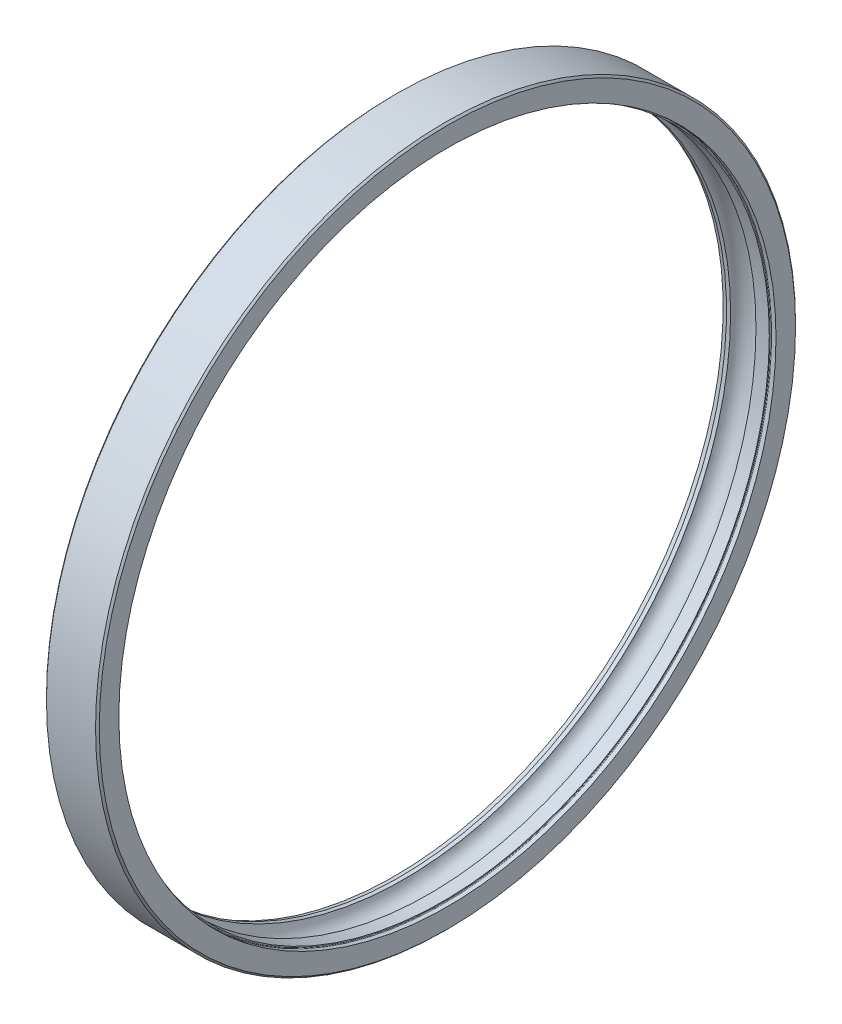
ISO-10303-21;
HEADER;
FILE_DESCRIPTION(('STEP AP214'),'2;1');
FILE_NAME('part.step','',(''),(''),'','','');
FILE_SCHEMA(('AUTOMOTIVE_DESIGN { 1 0 10303 214 1 1 1 1 }'));
ENDSEC;
DATA;
#1=APPLICATION_CONTEXT('core data for automotive mechanical design processes');
#2=APPLICATION_PROTOCOL_DEFINITION('international standard','automotive_design',2000,#1);
#3=PRODUCT_CONTEXT('',#1,'mechanical');
#4=PRODUCT('Part','Part','',(#3));
#5=PRODUCT_RELATED_PRODUCT_CATEGORY('part','',(#4));
#6=PRODUCT_DEFINITION_FORMATION('','',#4);
#7=PRODUCT_DEFINITION_CONTEXT('part definition',#1,'design');
#8=PRODUCT_DEFINITION('design','',#6,#7);
#9=PRODUCT_DEFINITION_SHAPE('','',#8);
#10=(LENGTH_UNIT() NAMED_UNIT(*) SI_UNIT(.MILLI.,.METRE.));
#11=(NAMED_UNIT(*) PLANE_ANGLE_UNIT() SI_UNIT($,.RADIAN.));
#12=(NAMED_UNIT(*) SI_UNIT($,.STERADIAN.) SOLID_ANGLE_UNIT());
#13=UNCERTAINTY_MEASURE_WITH_UNIT(LENGTH_MEASURE(1.E-05),#10,'distance_accuracy_value','');
#14=(GEOMETRIC_REPRESENTATION_CONTEXT(3) GLOBAL_UNCERTAINTY_ASSIGNED_CONTEXT((#13)) GLOBAL_UNIT_ASSIGNED_CONTEXT((#10,
#11,#12)) REPRESENTATION_CONTEXT('',''));
#15=CARTESIAN_POINT('',(0.,0.,0.));
#16=DIRECTION('',(0.,0.,1.));
#17=DIRECTION('',(1.,0.,0.));
#18=AXIS2_PLACEMENT_3D('',#15,#16,#17);
#19=CARTESIAN_POINT('',(-4.,-53.3012864825976,-52.717157287525));
#20=DIRECTION('',(-1.,0.,0.));
#21=DIRECTION('',(0.,0.,1.));
#22=AXIS2_PLACEMENT_3D('',#19,#20,#21);
#23=PLANE('',#22);
#24=CARTESIAN_POINT('',(-4.,0.,0.));
#25=DIRECTION('',(-1.,0.,0.));
#26=DIRECTION('',(0.,0.,-1.));
#27=AXIS2_PLACEMENT_3D('',#24,#25,#26);
#28=CIRCLE('',#27,52.717157287525);
#29=CARTESIAN_POINT('',(-4.,0.,-52.717157287525));
#30=VERTEX_POINT('',#29);
#31=EDGE_CURVE('E62',#30,#30,#28,.F.);
#32=ORIENTED_EDGE('',*,*,#31,.F.);
#33=EDGE_LOOP('',(#32));
#34=FACE_BOUND('',#33,.T.);
#35=CARTESIAN_POINT('',(-4.,0.,0.));
#36=DIRECTION('',(1.,0.,0.));
#37=DIRECTION('',(0.,0.,1.));
#38=AXIS2_PLACEMENT_3D('',#35,#36,#37);
#39=CIRCLE('',#38,49.755);
#40=CARTESIAN_POINT('',(-4.,0.,49.755));
#41=VERTEX_POINT('',#40);
#42=EDGE_CURVE('E59',#41,#41,#39,.T.);
#43=ORIENTED_EDGE('',*,*,#42,.T.);
#44=EDGE_LOOP('',(#43));
#45=FACE_BOUND('',#44,.T.);
#46=ADVANCED_FACE('F15',(#34,#45),#23,.T.);
#47=CARTESIAN_POINT('',(4.,-53.3012864944016,52.717157287525));
#48=DIRECTION('',(1.,0.,0.));
#49=DIRECTION('',(0.,0.,-1.));
#50=AXIS2_PLACEMENT_3D('',#47,#48,#49);
#51=PLANE('',#50);
#52=CARTESIAN_POINT('',(4.,0.,0.));
#53=DIRECTION('',(1.,0.,0.));
#54=DIRECTION('',(0.,-1.16840780209601E-09,1.));
#55=AXIS2_PLACEMENT_3D('',#52,#53,#54);
#56=CIRCLE('',#55,52.717157287525);
#57=CARTESIAN_POINT('',(4.,-6.15951378790669E-08,52.717157287525));
#58=VERTEX_POINT('',#57);
#59=EDGE_CURVE('E56',#58,#58,#56,.T.);
#60=ORIENTED_EDGE('',*,*,#59,.T.);
#61=EDGE_LOOP('',(#60));
#62=FACE_BOUND('',#61,.T.);
#63=CARTESIAN_POINT('',(4.,0.,0.));
#64=DIRECTION('',(-1.,0.,0.));
#65=DIRECTION('',(0.,0.,-1.));
#66=AXIS2_PLACEMENT_3D('',#63,#64,#65);
#67=CIRCLE('',#66,49.755);
#68=CARTESIAN_POINT('',(4.,0.,-49.755));
#69=VERTEX_POINT('',#68);
#70=EDGE_CURVE('E53',#69,#69,#67,.F.);
#71=ORIENTED_EDGE('',*,*,#70,.F.);
#72=EDGE_LOOP('',(#71));
#73=FACE_BOUND('',#72,.T.);
#74=ADVANCED_FACE('F71',(#62,#73),#51,.T.);
#75=CARTESIAN_POINT('',(3.24,-50.205199242003,-49.655));
#76=DIRECTION('',(1.,0.,0.));
#77=DIRECTION('',(0.,1.,0.));
#78=AXIS2_PLACEMENT_3D('',#75,#76,#77);
#79=PLANE('',#78);
#80=CARTESIAN_POINT('',(3.24,0.,0.));
#81=DIRECTION('',(1.,0.,0.));
#82=DIRECTION('',(0.,0.,1.));
#83=AXIS2_PLACEMENT_3D('',#80,#81,#82);
#84=CIRCLE('',#83,49.655);
#85=CARTESIAN_POINT('',(3.24,0.,49.655));
#86=VERTEX_POINT('',#85);
#87=EDGE_CURVE('E50',#86,#86,#84,.T.);
#88=ORIENTED_EDGE('',*,*,#87,.T.);
#89=EDGE_LOOP('',(#88));
#90=FACE_BOUND('',#89,.T.);
#91=CARTESIAN_POINT('',(3.24,0.,0.));
#92=DIRECTION('',(-1.,0.,0.));
#93=DIRECTION('',(0.,0.,-1.));
#94=AXIS2_PLACEMENT_3D('',#91,#92,#93);
#95=CIRCLE('',#94,49.5);
#96=CARTESIAN_POINT('',(3.24,0.,-49.5));
#97=VERTEX_POINT('',#96);
#98=EDGE_CURVE('E47',#97,#97,#95,.F.);
#99=ORIENTED_EDGE('',*,*,#98,.F.);
#100=EDGE_LOOP('',(#99));
#101=FACE_BOUND('',#100,.T.);
#102=ADVANCED_FACE('F115',(#90,#101),#79,.T.);
#103=CARTESIAN_POINT('',(-3.24,-50.205199242003,49.655));
#104=DIRECTION('',(-1.,0.,0.));
#105=DIRECTION('',(0.,1.,0.));
#106=AXIS2_PLACEMENT_3D('',#103,#104,#105);
#107=PLANE('',#106);
#108=CARTESIAN_POINT('',(-3.24,0.,0.));
#109=DIRECTION('',(-1.,0.,0.));
#110=DIRECTION('',(0.,0.,-1.));
#111=AXIS2_PLACEMENT_3D('',#108,#109,#110);
#112=CIRCLE('',#111,49.655);
#113=CARTESIAN_POINT('',(-3.24,0.,-49.655));
#114=VERTEX_POINT('',#113);
#115=EDGE_CURVE('E44',#114,#114,#112,.F.);
#116=ORIENTED_EDGE('',*,*,#115,.F.);
#117=EDGE_LOOP('',(#116));
#118=FACE_BOUND('',#117,.T.);
#119=CARTESIAN_POINT('',(-3.24,0.,0.));
#120=DIRECTION('',(1.,0.,0.));
#121=DIRECTION('',(0.,0.,1.));
#122=AXIS2_PLACEMENT_3D('',#119,#120,#121);
#123=CIRCLE('',#122,49.5);
#124=CARTESIAN_POINT('',(-3.24,0.,49.5));
#125=VERTEX_POINT('',#124);
#126=EDGE_CURVE('E41',#125,#125,#123,.T.);
#127=ORIENTED_EDGE('',*,*,#126,.T.);
#128=EDGE_LOOP('',(#127));
#129=FACE_BOUND('',#128,.T.);
#130=ADVANCED_FACE('F111',(#118,#129),#107,.T.);
#131=CARTESIAN_POINT('',(3.71715728752539,0.,0.));
#132=DIRECTION('',(-1.,0.,0.));
#133=DIRECTION('',(0.,0.,-1.));
#134=AXIS2_PLACEMENT_3D('',#131,#132,#133);
#135=CONICAL_SURFACE('',#134,53.,0.785398163398146);
#136=ORIENTED_EDGE('',*,*,#59,.F.);
#137=EDGE_LOOP('',(#136));
#138=FACE_BOUND('',#137,.T.);
#139=CARTESIAN_POINT('',(3.71715728752539,0.,0.));
#140=DIRECTION('',(1.,0.,0.));
#141=DIRECTION('',(0.,0.,1.));
#142=AXIS2_PLACEMENT_3D('',#139,#140,#141);
#143=CIRCLE('',#142,53.);
#144=CARTESIAN_POINT('',(3.71715728752539,0.,53.));
#145=VERTEX_POINT('',#144);
#146=EDGE_CURVE('E38',#145,#145,#143,.T.);
#147=ORIENTED_EDGE('',*,*,#146,.T.);
#148=EDGE_LOOP('',(#147));
#149=FACE_BOUND('',#148,.T.);
#150=ADVANCED_FACE('F107',(#138,#149),#135,.T.);
#151=CARTESIAN_POINT('',(10.,0.,0.));
#152=DIRECTION('',(1.,0.,0.));
#153=DIRECTION('',(0.,0.,1.));
#154=AXIS2_PLACEMENT_3D('',#151,#152,#153);
#155=CYLINDRICAL_SURFACE('',#154,53.);
#156=CARTESIAN_POINT('',(-3.7171572875254,0.,0.));
#157=DIRECTION('',(1.,0.,0.));
#158=DIRECTION('',(0.,0.,1.));
#159=AXIS2_PLACEMENT_3D('',#156,#157,#158);
#160=CIRCLE('',#159,53.);
#161=CARTESIAN_POINT('',(-3.7171572875254,0.,53.));
#162=VERTEX_POINT('',#161);
#163=EDGE_CURVE('E35',#162,#162,#160,.T.);
#164=ORIENTED_EDGE('',*,*,#163,.T.);
#165=EDGE_LOOP('',(#164));
#166=FACE_BOUND('',#165,.T.);
#167=ORIENTED_EDGE('',*,*,#146,.F.);
#168=EDGE_LOOP('',(#167));
#169=FACE_BOUND('',#168,.T.);
#170=ADVANCED_FACE('F104',(#166,#169),#155,.T.);
#171=CARTESIAN_POINT('',(-3.7171572875254,0.,0.));
#172=DIRECTION('',(1.,0.,0.));
#173=DIRECTION('',(0.,0.,1.));
#174=AXIS2_PLACEMENT_3D('',#171,#172,#173);
#175=CONICAL_SURFACE('',#174,53.,0.785398163398154);
#176=ORIENTED_EDGE('',*,*,#31,.T.);
#177=EDGE_LOOP('',(#176));
#178=FACE_BOUND('',#177,.T.);
#179=ORIENTED_EDGE('',*,*,#163,.F.);
#180=EDGE_LOOP('',(#179));
#181=FACE_BOUND('',#180,.T.);
#182=ADVANCED_FACE('F66',(#178,#181),#175,.T.);
#183=CARTESIAN_POINT('',(3.33999999999932,0.,0.));
#184=DIRECTION('',(1.,0.,0.));
#185=DIRECTION('',(0.,0.,1.));
#186=AXIS2_PLACEMENT_3D('',#183,#184,#185);
#187=TOROIDAL_SURFACE('',#186,49.6550000000007,0.0999999999993229);
#188=ORIENTED_EDGE('',*,*,#87,.F.);
#189=EDGE_LOOP('',(#188));
#190=FACE_BOUND('',#189,.T.);
#191=CARTESIAN_POINT('',(3.33999999999932,0.,0.));
#192=DIRECTION('',(1.,0.,0.));
#193=DIRECTION('',(0.,0.,1.));
#194=AXIS2_PLACEMENT_3D('',#191,#192,#193);
#195=CIRCLE('',#194,49.755);
#196=CARTESIAN_POINT('',(3.33999999999932,0.,49.755));
#197=VERTEX_POINT('',#196);
#198=EDGE_CURVE('E30',#197,#197,#195,.T.);
#199=ORIENTED_EDGE('',*,*,#198,.T.);
#200=EDGE_LOOP('',(#199));
#201=FACE_BOUND('',#200,.T.);
#202=ADVANCED_FACE('F97',(#190,#201),#187,.F.);
#203=CARTESIAN_POINT('',(4.,0.,0.));
#204=DIRECTION('',(1.,0.,0.));
#205=DIRECTION('',(0.,1.16834776332106E-09,1.));
#206=AXIS2_PLACEMENT_3D('',#203,#204,#205);
#207=CYLINDRICAL_SURFACE('',#206,49.755);
#208=ORIENTED_EDGE('',*,*,#70,.T.);
#209=EDGE_LOOP('',(#208));
#210=FACE_BOUND('',#209,.T.);
#211=ORIENTED_EDGE('',*,*,#198,.F.);
#212=EDGE_LOOP('',(#211));
#213=FACE_BOUND('',#212,.T.);
#214=ADVANCED_FACE('F93',(#210,#213),#207,.F.);
#215=CARTESIAN_POINT('',(10.,0.,0.));
#216=DIRECTION('',(1.,0.,0.));
#217=DIRECTION('',(0.,1.92344929213359E-10,1.));
#218=AXIS2_PLACEMENT_3D('',#215,#216,#217);
#219=CYLINDRICAL_SURFACE('',#218,49.5);
#220=ORIENTED_EDGE('',*,*,#98,.T.);
#221=EDGE_LOOP('',(#220));
#222=FACE_BOUND('',#221,.T.);
#223=CARTESIAN_POINT('',(1.22147917197766,0.,0.));
#224=DIRECTION('',(-1.,0.,0.));
#225=DIRECTION('',(0.,0.,-1.));
#226=AXIS2_PLACEMENT_3D('',#223,#224,#225);
#227=CIRCLE('',#226,49.5);
#228=CARTESIAN_POINT('',(1.22147917197766,0.,-49.5));
#229=VERTEX_POINT('',#228);
#230=EDGE_CURVE('E26',#229,#229,#227,.F.);
#231=ORIENTED_EDGE('',*,*,#230,.F.);
#232=EDGE_LOOP('',(#231));
#233=FACE_BOUND('',#232,.T.);
#234=ADVANCED_FACE('F90',(#222,#233),#219,.F.);
#235=CARTESIAN_POINT('',(-0.699,0.,0.));
#236=DIRECTION('',(1.,0.,0.));
#237=DIRECTION('',(0.,0.,1.));
#238=AXIS2_PLACEMENT_3D('',#235,#236,#237);
#239=TOROIDAL_SURFACE('',#238,49.,1.9845);
#240=CARTESIAN_POINT('',(-2.61947917197766,0.,0.));
#241=DIRECTION('',(-1.,0.,0.));
#242=DIRECTION('',(0.,0.,-1.));
#243=AXIS2_PLACEMENT_3D('',#240,#241,#242);
#244=CIRCLE('',#243,49.5);
#245=CARTESIAN_POINT('',(-2.61947917197766,0.,-49.5));
#246=VERTEX_POINT('',#245);
#247=EDGE_CURVE('E22',#246,#246,#244,.T.);
#248=ORIENTED_EDGE('',*,*,#247,.T.);
#249=EDGE_LOOP('',(#248));
#250=FACE_BOUND('',#249,.T.);
#251=ORIENTED_EDGE('',*,*,#230,.T.);
#252=EDGE_LOOP('',(#251));
#253=FACE_BOUND('',#252,.T.);
#254=ADVANCED_FACE('F84',(#250,#253),#239,.F.);
#255=CARTESIAN_POINT('',(10.,0.,0.));
#256=DIRECTION('',(1.,0.,0.));
#257=DIRECTION('',(0.,0.,1.));
#258=AXIS2_PLACEMENT_3D('',#255,#256,#257);
#259=CYLINDRICAL_SURFACE('',#258,49.5);
#260=ORIENTED_EDGE('',*,*,#247,.F.);
#261=EDGE_LOOP('',(#260));
#262=FACE_BOUND('',#261,.T.);
#263=ORIENTED_EDGE('',*,*,#126,.F.);
#264=EDGE_LOOP('',(#263));
#265=FACE_BOUND('',#264,.T.);
#266=ADVANCED_FACE('F77',(#262,#265),#259,.F.);
#267=CARTESIAN_POINT('',(4.,0.,0.));
#268=DIRECTION('',(1.,0.,0.));
#269=DIRECTION('',(0.,0.,1.));
#270=AXIS2_PLACEMENT_3D('',#267,#268,#269);
#271=CYLINDRICAL_SURFACE('',#270,49.755);
#272=ORIENTED_EDGE('',*,*,#42,.F.);
#273=EDGE_LOOP('',(#272));
#274=FACE_BOUND('',#273,.T.);
#275=CARTESIAN_POINT('',(-3.34,0.,0.));
#276=DIRECTION('',(1.,0.,0.));
#277=DIRECTION('',(0.,0.,1.));
#278=AXIS2_PLACEMENT_3D('',#275,#276,#277);
#279=CIRCLE('',#278,49.755);
#280=CARTESIAN_POINT('',(-3.34,0.,49.755));
#281=VERTEX_POINT('',#280);
#282=EDGE_CURVE('E10',#281,#281,#279,.T.);
#283=ORIENTED_EDGE('',*,*,#282,.T.);
#284=EDGE_LOOP('',(#283));
#285=FACE_BOUND('',#284,.T.);
#286=ADVANCED_FACE('F75',(#274,#285),#271,.F.);
#287=CARTESIAN_POINT('',(-3.33999999999932,0.,0.));
#288=DIRECTION('',(1.,0.,0.));
#289=DIRECTION('',(0.,0.,1.));
#290=AXIS2_PLACEMENT_3D('',#287,#288,#289);
#291=TOROIDAL_SURFACE('',#290,49.6550000000007,0.0999999999993242);
#292=ORIENTED_EDGE('',*,*,#115,.T.);
#293=EDGE_LOOP('',(#292));
#294=FACE_BOUND('',#293,.T.);
#295=ORIENTED_EDGE('',*,*,#282,.F.);
#296=EDGE_LOOP('',(#295));
#297=FACE_BOUND('',#296,.T.);
#298=ADVANCED_FACE('F17',(#294,#297),#291,.F.);
#299=CLOSED_SHELL('',(#46,#74,#102,#130,#150,#170,#182,#202,#214,#234,#254,#266,#286,#298));
#300=MANIFOLD_SOLID_BREP('B1',#299);
#301=ADVANCED_BREP_SHAPE_REPRESENTATION('',(#18,#300),#14);
#302=SHAPE_DEFINITION_REPRESENTATION(#9,#301);
ENDSEC;
END-ISO-10303-21;
